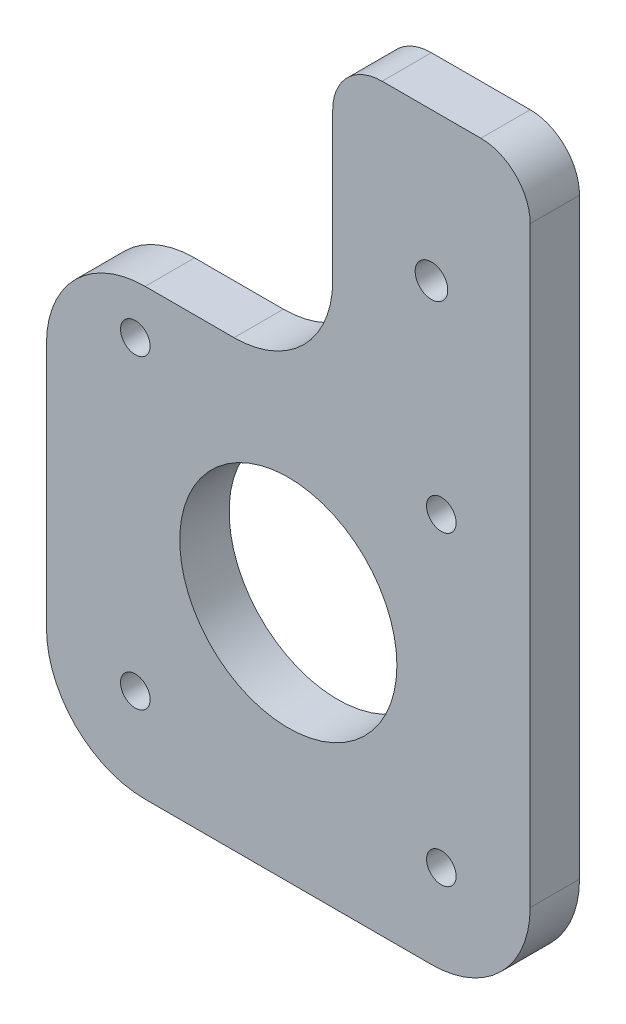
ISO-10303-21;
HEADER;
FILE_DESCRIPTION(('STEP AP214'),'2;1');
FILE_NAME('part.step','',(''),(''),'','','');
FILE_SCHEMA(('AUTOMOTIVE_DESIGN { 1 0 10303 214 1 1 1 1 }'));
ENDSEC;
DATA;
#1=APPLICATION_CONTEXT('core data for automotive mechanical design processes');
#2=APPLICATION_PROTOCOL_DEFINITION('international standard','automotive_design',2000,#1);
#3=PRODUCT_CONTEXT('',#1,'mechanical');
#4=PRODUCT('Part','Part','',(#3));
#5=PRODUCT_RELATED_PRODUCT_CATEGORY('part','',(#4));
#6=PRODUCT_DEFINITION_FORMATION('','',#4);
#7=PRODUCT_DEFINITION_CONTEXT('part definition',#1,'design');
#8=PRODUCT_DEFINITION('design','',#6,#7);
#9=PRODUCT_DEFINITION_SHAPE('','',#8);
#10=(LENGTH_UNIT() NAMED_UNIT(*) SI_UNIT(.MILLI.,.METRE.));
#11=(NAMED_UNIT(*) PLANE_ANGLE_UNIT() SI_UNIT($,.RADIAN.));
#12=(NAMED_UNIT(*) SI_UNIT($,.STERADIAN.) SOLID_ANGLE_UNIT());
#13=UNCERTAINTY_MEASURE_WITH_UNIT(LENGTH_MEASURE(1.E-05),#10,'distance_accuracy_value','');
#14=(GEOMETRIC_REPRESENTATION_CONTEXT(3) GLOBAL_UNCERTAINTY_ASSIGNED_CONTEXT((#13)) GLOBAL_UNIT_ASSIGNED_CONTEXT((#10,
#11,#12)) REPRESENTATION_CONTEXT('',''));
#15=CARTESIAN_POINT('',(0.,0.,0.));
#16=DIRECTION('',(0.,0.,1.));
#17=DIRECTION('',(1.,0.,0.));
#18=AXIS2_PLACEMENT_3D('',#15,#16,#17);
#19=CARTESIAN_POINT('',(0.,0.,5.));
#20=DIRECTION('',(0.,0.,1.));
#21=DIRECTION('',(1.,0.,0.));
#22=AXIS2_PLACEMENT_3D('',#19,#20,#21);
#23=PLANE('',#22);
#24=CARTESIAN_POINT('',(34.8834350731139,-36.,5.));
#25=DIRECTION('',(0.,0.,1.));
#26=DIRECTION('',(1.,0.,0.));
#27=AXIS2_PLACEMENT_3D('',#24,#25,#26);
#28=CIRCLE('',#27,1.5);
#29=CARTESIAN_POINT('',(36.3834350731139,-36.,5.));
#30=VERTEX_POINT('',#29);
#31=EDGE_CURVE('E326',#30,#30,#28,.T.);
#32=ORIENTED_EDGE('',*,*,#31,.F.);
#33=EDGE_LOOP('',(#32));
#34=FACE_BOUND('',#33,.T.);
#35=CARTESIAN_POINT('',(34.8834350731139,-5.,5.));
#36=DIRECTION('',(0.,0.,1.));
#37=DIRECTION('',(1.,0.,0.));
#38=AXIS2_PLACEMENT_3D('',#35,#36,#37);
#39=CIRCLE('',#38,1.5);
#40=CARTESIAN_POINT('',(36.3834350731139,-5.,5.));
#41=VERTEX_POINT('',#40);
#42=EDGE_CURVE('E310',#41,#41,#39,.T.);
#43=ORIENTED_EDGE('',*,*,#42,.F.);
#44=EDGE_LOOP('',(#43));
#45=FACE_BOUND('',#44,.T.);
#46=CARTESIAN_POINT('',(33.8834350731139,15.,5.));
#47=DIRECTION('',(0.,0.,1.));
#48=DIRECTION('',(1.,0.,0.));
#49=AXIS2_PLACEMENT_3D('',#46,#47,#48);
#50=CIRCLE('',#49,1.65);
#51=CARTESIAN_POINT('',(35.5334350731139,15.,5.));
#52=VERTEX_POINT('',#51);
#53=EDGE_CURVE('E163',#52,#52,#50,.T.);
#54=ORIENTED_EDGE('',*,*,#53,.F.);
#55=EDGE_LOOP('',(#54));
#56=FACE_BOUND('',#55,.T.);
#57=DIRECTION('',(-1.,0.,0.));
#58=VECTOR('',#57,1.);
#59=CARTESIAN_POINT('',(23.8834350731139,30.,5.));
#60=LINE('',#59,#58);
#61=CARTESIAN_POINT('',(38.8834350731139,30.,5.));
#62=VERTEX_POINT('',#61);
#63=CARTESIAN_POINT('',(28.8834350731139,30.,5.));
#64=VERTEX_POINT('',#63);
#65=EDGE_CURVE('E252',#62,#64,#60,.T.);
#66=ORIENTED_EDGE('',*,*,#65,.T.);
#67=CARTESIAN_POINT('',(28.8834350731139,25.,5.));
#68=DIRECTION('',(0.,0.,1.));
#69=DIRECTION('',(1.,0.,0.));
#70=AXIS2_PLACEMENT_3D('',#67,#68,#69);
#71=CIRCLE('',#70,5.);
#72=CARTESIAN_POINT('',(23.8834350731139,25.,5.));
#73=VERTEX_POINT('',#72);
#74=EDGE_CURVE('E48',#64,#73,#71,.T.);
#75=ORIENTED_EDGE('',*,*,#74,.T.);
#76=DIRECTION('',(0.,-1.,0.));
#77=VECTOR('',#76,1.);
#78=CARTESIAN_POINT('',(23.8834350731139,30.,5.));
#79=LINE('',#78,#77);
#80=CARTESIAN_POINT('',(23.8834350731139,10.,5.));
#81=VERTEX_POINT('',#80);
#82=EDGE_CURVE('E174',#73,#81,#79,.T.);
#83=ORIENTED_EDGE('',*,*,#82,.T.);
#84=CARTESIAN_POINT('',(13.8834350731139,10.,5.));
#85=DIRECTION('',(0.,0.,1.));
#86=DIRECTION('',(1.,0.,0.));
#87=AXIS2_PLACEMENT_3D('',#84,#85,#86);
#88=CIRCLE('',#87,10.);
#89=CARTESIAN_POINT('',(13.8834350731139,0.,5.));
#90=VERTEX_POINT('',#89);
#91=EDGE_CURVE('E143',#81,#90,#88,.F.);
#92=ORIENTED_EDGE('',*,*,#91,.T.);
#93=DIRECTION('',(-1.,0.,0.));
#94=VECTOR('',#93,1.);
#95=CARTESIAN_POINT('',(23.8834350731139,0.,5.));
#96=LINE('',#95,#94);
#97=CARTESIAN_POINT('',(4.88343507311392,0.,5.));
#98=VERTEX_POINT('',#97);
#99=EDGE_CURVE('E153',#90,#98,#96,.T.);
#100=ORIENTED_EDGE('',*,*,#99,.T.);
#101=CARTESIAN_POINT('',(4.88343507311392,-10.,5.));
#102=DIRECTION('',(0.,0.,1.));
#103=DIRECTION('',(1.,0.,0.));
#104=AXIS2_PLACEMENT_3D('',#101,#102,#103);
#105=CIRCLE('',#104,10.);
#106=CARTESIAN_POINT('',(-5.11656492688608,-9.99999999999999,5.));
#107=VERTEX_POINT('',#106);
#108=EDGE_CURVE('E215',#98,#107,#105,.T.);
#109=ORIENTED_EDGE('',*,*,#108,.T.);
#110=DIRECTION('',(0.,-1.,0.));
#111=VECTOR('',#110,1.);
#112=CARTESIAN_POINT('',(-5.11656492688608,0.,5.));
#113=LINE('',#112,#111);
#114=CARTESIAN_POINT('',(-5.11656492688609,-35.,5.));
#115=VERTEX_POINT('',#114);
#116=EDGE_CURVE('E288',#107,#115,#113,.T.);
#117=ORIENTED_EDGE('',*,*,#116,.T.);
#118=CARTESIAN_POINT('',(4.88343507311391,-35.,5.));
#119=DIRECTION('',(0.,0.,1.));
#120=DIRECTION('',(1.,0.,0.));
#121=AXIS2_PLACEMENT_3D('',#118,#119,#120);
#122=CIRCLE('',#121,10.);
#123=CARTESIAN_POINT('',(4.88343507311392,-45.,5.));
#124=VERTEX_POINT('',#123);
#125=EDGE_CURVE('E221',#115,#124,#122,.T.);
#126=ORIENTED_EDGE('',*,*,#125,.T.);
#127=DIRECTION('',(1.,0.,0.));
#128=VECTOR('',#127,1.);
#129=CARTESIAN_POINT('',(43.8834350731139,-45.,5.));
#130=LINE('',#129,#128);
#131=CARTESIAN_POINT('',(33.8834350731139,-45.,5.));
#132=VERTEX_POINT('',#131);
#133=EDGE_CURVE('E278',#124,#132,#130,.T.);
#134=ORIENTED_EDGE('',*,*,#133,.T.);
#135=CARTESIAN_POINT('',(33.8834350731139,-35.,5.));
#136=DIRECTION('',(0.,0.,1.));
#137=DIRECTION('',(1.,0.,0.));
#138=AXIS2_PLACEMENT_3D('',#135,#136,#137);
#139=CIRCLE('',#138,10.);
#140=CARTESIAN_POINT('',(43.8834350731139,-35.,5.));
#141=VERTEX_POINT('',#140);
#142=EDGE_CURVE('E218',#132,#141,#139,.T.);
#143=ORIENTED_EDGE('',*,*,#142,.T.);
#144=DIRECTION('',(0.,1.,0.));
#145=VECTOR('',#144,1.);
#146=CARTESIAN_POINT('',(43.8834350731139,30.,5.));
#147=LINE('',#146,#145);
#148=CARTESIAN_POINT('',(43.8834350731139,25.,5.));
#149=VERTEX_POINT('',#148);
#150=EDGE_CURVE('E267',#141,#149,#147,.T.);
#151=ORIENTED_EDGE('',*,*,#150,.T.);
#152=CARTESIAN_POINT('',(38.8834350731139,25.,5.));
#153=DIRECTION('',(0.,0.,1.));
#154=DIRECTION('',(1.,0.,0.));
#155=AXIS2_PLACEMENT_3D('',#152,#153,#154);
#156=CIRCLE('',#155,5.);
#157=EDGE_CURVE('E245',#149,#62,#156,.T.);
#158=ORIENTED_EDGE('',*,*,#157,.T.);
#159=EDGE_LOOP('',(#66,#75,#83,#92,#100,#109,#117,#126,#134,#143,#151,#158));
#160=FACE_BOUND('',#159,.T.);
#161=CARTESIAN_POINT('',(3.8834350731139,-5.,5.));
#162=DIRECTION('',(0.,0.,1.));
#163=DIRECTION('',(1.,0.,0.));
#164=AXIS2_PLACEMENT_3D('',#161,#162,#163);
#165=CIRCLE('',#164,1.5);
#166=CARTESIAN_POINT('',(5.38343507311391,-5.,5.));
#167=VERTEX_POINT('',#166);
#168=EDGE_CURVE('E304',#167,#167,#165,.T.);
#169=ORIENTED_EDGE('',*,*,#168,.F.);
#170=EDGE_LOOP('',(#169));
#171=FACE_BOUND('',#170,.T.);
#172=CARTESIAN_POINT('',(3.88343507311391,-36.,5.));
#173=DIRECTION('',(0.,0.,1.));
#174=DIRECTION('',(1.,0.,0.));
#175=AXIS2_PLACEMENT_3D('',#172,#173,#174);
#176=CIRCLE('',#175,1.5);
#177=CARTESIAN_POINT('',(5.38343507311391,-36.,5.));
#178=VERTEX_POINT('',#177);
#179=EDGE_CURVE('E318',#178,#178,#176,.T.);
#180=ORIENTED_EDGE('',*,*,#179,.F.);
#181=EDGE_LOOP('',(#180));
#182=FACE_BOUND('',#181,.T.);
#183=CARTESIAN_POINT('',(19.3834350731139,-20.5,5.));
#184=DIRECTION('',(0.,0.,1.));
#185=DIRECTION('',(1.,0.,0.));
#186=AXIS2_PLACEMENT_3D('',#183,#184,#185);
#187=CIRCLE('',#186,11.);
#188=CARTESIAN_POINT('',(30.3834350731139,-20.5,5.));
#189=VERTEX_POINT('',#188);
#190=EDGE_CURVE('E334',#189,#189,#187,.T.);
#191=ORIENTED_EDGE('',*,*,#190,.F.);
#192=EDGE_LOOP('',(#191));
#193=FACE_BOUND('',#192,.T.);
#194=ADVANCED_FACE('F39',(#34,#45,#56,#160,#171,#182,#193),#23,.T.);
#195=CARTESIAN_POINT('',(0.,0.,0.));
#196=DIRECTION('',(0.,0.,1.));
#197=DIRECTION('',(1.,0.,0.));
#198=AXIS2_PLACEMENT_3D('',#195,#196,#197);
#199=PLANE('',#198);
#200=DIRECTION('',(0.,-1.,0.));
#201=VECTOR('',#200,1.);
#202=CARTESIAN_POINT('',(23.8834350731139,30.,0.));
#203=LINE('',#202,#201);
#204=CARTESIAN_POINT('',(23.8834350731139,25.,0.));
#205=VERTEX_POINT('',#204);
#206=CARTESIAN_POINT('',(23.8834350731139,10.,0.));
#207=VERTEX_POINT('',#206);
#208=EDGE_CURVE('E186',#205,#207,#203,.T.);
#209=ORIENTED_EDGE('',*,*,#208,.F.);
#210=CARTESIAN_POINT('',(28.8834350731139,25.,0.));
#211=DIRECTION('',(0.,0.,1.));
#212=DIRECTION('',(1.,0.,0.));
#213=AXIS2_PLACEMENT_3D('',#210,#211,#212);
#214=CIRCLE('',#213,5.);
#215=CARTESIAN_POINT('',(28.8834350731139,30.,0.));
#216=VERTEX_POINT('',#215);
#217=EDGE_CURVE('E236',#205,#216,#214,.F.);
#218=ORIENTED_EDGE('',*,*,#217,.T.);
#219=DIRECTION('',(-1.,0.,0.));
#220=VECTOR('',#219,1.);
#221=CARTESIAN_POINT('',(23.8834350731139,30.,0.));
#222=LINE('',#221,#220);
#223=CARTESIAN_POINT('',(38.8834350731139,30.,0.));
#224=VERTEX_POINT('',#223);
#225=EDGE_CURVE('E183',#224,#216,#222,.T.);
#226=ORIENTED_EDGE('',*,*,#225,.F.);
#227=CARTESIAN_POINT('',(38.8834350731139,25.,0.));
#228=DIRECTION('',(0.,0.,1.));
#229=DIRECTION('',(1.,0.,0.));
#230=AXIS2_PLACEMENT_3D('',#227,#228,#229);
#231=CIRCLE('',#230,5.);
#232=CARTESIAN_POINT('',(43.8834350731139,25.,0.));
#233=VERTEX_POINT('',#232);
#234=EDGE_CURVE('E233',#224,#233,#231,.F.);
#235=ORIENTED_EDGE('',*,*,#234,.T.);
#236=DIRECTION('',(0.,1.,0.));
#237=VECTOR('',#236,1.);
#238=CARTESIAN_POINT('',(43.8834350731139,30.,0.));
#239=LINE('',#238,#237);
#240=CARTESIAN_POINT('',(43.8834350731139,-35.,0.));
#241=VERTEX_POINT('',#240);
#242=EDGE_CURVE('E180',#241,#233,#239,.T.);
#243=ORIENTED_EDGE('',*,*,#242,.F.);
#244=CARTESIAN_POINT('',(33.8834350731139,-35.,0.));
#245=DIRECTION('',(0.,0.,1.));
#246=DIRECTION('',(1.,0.,0.));
#247=AXIS2_PLACEMENT_3D('',#244,#245,#246);
#248=CIRCLE('',#247,10.);
#249=CARTESIAN_POINT('',(33.8834350731139,-45.,0.));
#250=VERTEX_POINT('',#249);
#251=EDGE_CURVE('E202',#241,#250,#248,.F.);
#252=ORIENTED_EDGE('',*,*,#251,.T.);
#253=DIRECTION('',(1.,0.,0.));
#254=VECTOR('',#253,1.);
#255=CARTESIAN_POINT('',(43.8834350731139,-45.,0.));
#256=LINE('',#255,#254);
#257=CARTESIAN_POINT('',(4.88343507311392,-45.,0.));
#258=VERTEX_POINT('',#257);
#259=EDGE_CURVE('E168',#258,#250,#256,.T.);
#260=ORIENTED_EDGE('',*,*,#259,.F.);
#261=CARTESIAN_POINT('',(4.88343507311391,-35.,0.));
#262=DIRECTION('',(0.,0.,1.));
#263=DIRECTION('',(1.,0.,0.));
#264=AXIS2_PLACEMENT_3D('',#261,#262,#263);
#265=CIRCLE('',#264,10.);
#266=CARTESIAN_POINT('',(-5.11656492688609,-35.,0.));
#267=VERTEX_POINT('',#266);
#268=EDGE_CURVE('E205',#258,#267,#265,.F.);
#269=ORIENTED_EDGE('',*,*,#268,.T.);
#270=DIRECTION('',(0.,-1.,0.));
#271=VECTOR('',#270,1.);
#272=CARTESIAN_POINT('',(-5.11656492688608,0.,0.));
#273=LINE('',#272,#271);
#274=CARTESIAN_POINT('',(-5.11656492688608,-9.99999999999999,0.));
#275=VERTEX_POINT('',#274);
#276=EDGE_CURVE('E162',#275,#267,#273,.T.);
#277=ORIENTED_EDGE('',*,*,#276,.F.);
#278=CARTESIAN_POINT('',(4.88343507311392,-10.,0.));
#279=DIRECTION('',(0.,0.,1.));
#280=DIRECTION('',(1.,0.,0.));
#281=AXIS2_PLACEMENT_3D('',#278,#279,#280);
#282=CIRCLE('',#281,10.);
#283=CARTESIAN_POINT('',(4.88343507311392,0.,0.));
#284=VERTEX_POINT('',#283);
#285=EDGE_CURVE('E160',#275,#284,#282,.F.);
#286=ORIENTED_EDGE('',*,*,#285,.T.);
#287=DIRECTION('',(-1.,0.,0.));
#288=VECTOR('',#287,1.);
#289=CARTESIAN_POINT('',(0.,0.,0.));
#290=LINE('',#289,#288);
#291=CARTESIAN_POINT('',(13.8834350731139,0.,0.));
#292=VERTEX_POINT('',#291);
#293=EDGE_CURVE('E150',#292,#284,#290,.T.);
#294=ORIENTED_EDGE('',*,*,#293,.F.);
#295=CARTESIAN_POINT('',(13.8834350731139,10.,0.));
#296=DIRECTION('',(0.,0.,1.));
#297=DIRECTION('',(1.,0.,0.));
#298=AXIS2_PLACEMENT_3D('',#295,#296,#297);
#299=CIRCLE('',#298,10.);
#300=EDGE_CURVE('E132',#292,#207,#299,.T.);
#301=ORIENTED_EDGE('',*,*,#300,.T.);
#302=EDGE_LOOP('',(#209,#218,#226,#235,#243,#252,#260,#269,#277,#286,#294,#301));
#303=FACE_BOUND('',#302,.T.);
#304=CARTESIAN_POINT('',(33.8834350731139,15.,0.));
#305=DIRECTION('',(0.,0.,1.));
#306=DIRECTION('',(1.,0.,0.));
#307=AXIS2_PLACEMENT_3D('',#304,#305,#306);
#308=CIRCLE('',#307,1.65);
#309=CARTESIAN_POINT('',(35.5334350731139,15.,0.));
#310=VERTEX_POINT('',#309);
#311=EDGE_CURVE('E171',#310,#310,#308,.T.);
#312=ORIENTED_EDGE('',*,*,#311,.T.);
#313=EDGE_LOOP('',(#312));
#314=FACE_BOUND('',#313,.T.);
#315=CARTESIAN_POINT('',(3.8834350731139,-5.,0.));
#316=DIRECTION('',(0.,0.,1.));
#317=DIRECTION('',(1.,0.,0.));
#318=AXIS2_PLACEMENT_3D('',#315,#316,#317);
#319=CIRCLE('',#318,1.5);
#320=CARTESIAN_POINT('',(5.38343507311391,-5.,0.));
#321=VERTEX_POINT('',#320);
#322=EDGE_CURVE('E306',#321,#321,#319,.T.);
#323=ORIENTED_EDGE('',*,*,#322,.T.);
#324=EDGE_LOOP('',(#323));
#325=FACE_BOUND('',#324,.T.);
#326=CARTESIAN_POINT('',(34.8834350731139,-5.,0.));
#327=DIRECTION('',(0.,0.,1.));
#328=DIRECTION('',(1.,0.,0.));
#329=AXIS2_PLACEMENT_3D('',#326,#327,#328);
#330=CIRCLE('',#329,1.5);
#331=CARTESIAN_POINT('',(36.3834350731139,-5.,0.));
#332=VERTEX_POINT('',#331);
#333=EDGE_CURVE('E314',#332,#332,#330,.T.);
#334=ORIENTED_EDGE('',*,*,#333,.T.);
#335=EDGE_LOOP('',(#334));
#336=FACE_BOUND('',#335,.T.);
#337=CARTESIAN_POINT('',(3.88343507311391,-36.,0.));
#338=DIRECTION('',(0.,0.,1.));
#339=DIRECTION('',(1.,0.,0.));
#340=AXIS2_PLACEMENT_3D('',#337,#338,#339);
#341=CIRCLE('',#340,1.5);
#342=CARTESIAN_POINT('',(5.38343507311391,-36.,0.));
#343=VERTEX_POINT('',#342);
#344=EDGE_CURVE('E322',#343,#343,#341,.T.);
#345=ORIENTED_EDGE('',*,*,#344,.T.);
#346=EDGE_LOOP('',(#345));
#347=FACE_BOUND('',#346,.T.);
#348=CARTESIAN_POINT('',(34.8834350731139,-36.,0.));
#349=DIRECTION('',(0.,0.,1.));
#350=DIRECTION('',(1.,0.,0.));
#351=AXIS2_PLACEMENT_3D('',#348,#349,#350);
#352=CIRCLE('',#351,1.5);
#353=CARTESIAN_POINT('',(36.3834350731139,-36.,0.));
#354=VERTEX_POINT('',#353);
#355=EDGE_CURVE('E330',#354,#354,#352,.T.);
#356=ORIENTED_EDGE('',*,*,#355,.T.);
#357=EDGE_LOOP('',(#356));
#358=FACE_BOUND('',#357,.T.);
#359=CARTESIAN_POINT('',(19.3834350731139,-20.5,0.));
#360=DIRECTION('',(0.,0.,1.));
#361=DIRECTION('',(1.,0.,0.));
#362=AXIS2_PLACEMENT_3D('',#359,#360,#361);
#363=CIRCLE('',#362,11.);
#364=CARTESIAN_POINT('',(30.3834350731139,-20.5,0.));
#365=VERTEX_POINT('',#364);
#366=EDGE_CURVE('E338',#365,#365,#363,.T.);
#367=ORIENTED_EDGE('',*,*,#366,.T.);
#368=EDGE_LOOP('',(#367));
#369=FACE_BOUND('',#368,.T.);
#370=ADVANCED_FACE('F157',(#303,#314,#325,#336,#347,#358,#369),#199,.F.);
#371=CARTESIAN_POINT('',(0.,0.,5.));
#372=DIRECTION('',(0.,-1.,0.));
#373=DIRECTION('',(0.,0.,-1.));
#374=AXIS2_PLACEMENT_3D('',#371,#372,#373);
#375=PLANE('',#374);
#376=ORIENTED_EDGE('',*,*,#99,.F.);
#377=DIRECTION('',(0.,0.,-1.));
#378=VECTOR('',#377,1.);
#379=CARTESIAN_POINT('',(13.8834350731139,0.,0.));
#380=LINE('',#379,#378);
#381=EDGE_CURVE('E136',#90,#292,#380,.T.);
#382=ORIENTED_EDGE('',*,*,#381,.T.);
#383=ORIENTED_EDGE('',*,*,#293,.T.);
#384=DIRECTION('',(0.,0.,-1.));
#385=VECTOR('',#384,1.);
#386=CARTESIAN_POINT('',(4.88343507311392,0.,5.));
#387=LINE('',#386,#385);
#388=EDGE_CURVE('E155',#284,#98,#387,.F.);
#389=ORIENTED_EDGE('',*,*,#388,.T.);
#390=EDGE_LOOP('',(#376,#382,#383,#389));
#391=FACE_BOUND('',#390,.T.);
#392=ADVANCED_FACE('F149',(#391),#375,.F.);
#393=CARTESIAN_POINT('',(-5.11656492688608,0.,5.));
#394=DIRECTION('',(1.,0.,0.));
#395=DIRECTION('',(0.,1.,0.));
#396=AXIS2_PLACEMENT_3D('',#393,#394,#395);
#397=PLANE('',#396);
#398=ORIENTED_EDGE('',*,*,#276,.T.);
#399=DIRECTION('',(0.,0.,-1.));
#400=VECTOR('',#399,1.);
#401=CARTESIAN_POINT('',(-5.11656492688609,-35.,5.));
#402=LINE('',#401,#400);
#403=EDGE_CURVE('E212',#267,#115,#402,.F.);
#404=ORIENTED_EDGE('',*,*,#403,.T.);
#405=ORIENTED_EDGE('',*,*,#116,.F.);
#406=DIRECTION('',(0.,0.,-1.));
#407=VECTOR('',#406,1.);
#408=CARTESIAN_POINT('',(-5.11656492688608,-10.,5.));
#409=LINE('',#408,#407);
#410=EDGE_CURVE('E208',#107,#275,#409,.T.);
#411=ORIENTED_EDGE('',*,*,#410,.T.);
#412=EDGE_LOOP('',(#398,#404,#405,#411));
#413=FACE_BOUND('',#412,.T.);
#414=ADVANCED_FACE('F284',(#413),#397,.F.);
#415=CARTESIAN_POINT('',(43.8834350731139,-45.,5.));
#416=DIRECTION('',(0.,1.,0.));
#417=DIRECTION('',(-1.,0.,0.));
#418=AXIS2_PLACEMENT_3D('',#415,#416,#417);
#419=PLANE('',#418);
#420=ORIENTED_EDGE('',*,*,#133,.F.);
#421=DIRECTION('',(0.,0.,-1.));
#422=VECTOR('',#421,1.);
#423=CARTESIAN_POINT('',(4.88343507311391,-45.,5.));
#424=LINE('',#423,#422);
#425=EDGE_CURVE('E196',#124,#258,#424,.T.);
#426=ORIENTED_EDGE('',*,*,#425,.T.);
#427=ORIENTED_EDGE('',*,*,#259,.T.);
#428=DIRECTION('',(0.,0.,-1.));
#429=VECTOR('',#428,1.);
#430=CARTESIAN_POINT('',(33.8834350731139,-45.,5.));
#431=LINE('',#430,#429);
#432=EDGE_CURVE('E193',#250,#132,#431,.F.);
#433=ORIENTED_EDGE('',*,*,#432,.T.);
#434=EDGE_LOOP('',(#420,#426,#427,#433));
#435=FACE_BOUND('',#434,.T.);
#436=ADVANCED_FACE('F275',(#435),#419,.F.);
#437=CARTESIAN_POINT('',(43.8834350731139,30.,5.));
#438=DIRECTION('',(-1.,0.,0.));
#439=DIRECTION('',(0.,-1.,0.));
#440=AXIS2_PLACEMENT_3D('',#437,#438,#439);
#441=PLANE('',#440);
#442=ORIENTED_EDGE('',*,*,#242,.T.);
#443=DIRECTION('',(0.,0.,-1.));
#444=VECTOR('',#443,1.);
#445=CARTESIAN_POINT('',(43.8834350731139,25.,5.));
#446=LINE('',#445,#444);
#447=EDGE_CURVE('E11',#233,#149,#446,.F.);
#448=ORIENTED_EDGE('',*,*,#447,.T.);
#449=ORIENTED_EDGE('',*,*,#150,.F.);
#450=DIRECTION('',(0.,0.,-1.));
#451=VECTOR('',#450,1.);
#452=CARTESIAN_POINT('',(43.8834350731139,-35.,5.));
#453=LINE('',#452,#451);
#454=EDGE_CURVE('E144',#141,#241,#453,.T.);
#455=ORIENTED_EDGE('',*,*,#454,.T.);
#456=EDGE_LOOP('',(#442,#448,#449,#455));
#457=FACE_BOUND('',#456,.T.);
#458=ADVANCED_FACE('F265',(#457),#441,.F.);
#459=CARTESIAN_POINT('',(23.8834350731139,30.,5.));
#460=DIRECTION('',(0.,-1.,0.));
#461=DIRECTION('',(0.,0.,-1.));
#462=AXIS2_PLACEMENT_3D('',#459,#460,#461);
#463=PLANE('',#462);
#464=ORIENTED_EDGE('',*,*,#225,.T.);
#465=DIRECTION('',(0.,0.,-1.));
#466=VECTOR('',#465,1.);
#467=CARTESIAN_POINT('',(28.8834350731139,30.,5.));
#468=LINE('',#467,#466);
#469=EDGE_CURVE('E61',#216,#64,#468,.F.);
#470=ORIENTED_EDGE('',*,*,#469,.T.);
#471=ORIENTED_EDGE('',*,*,#65,.F.);
#472=DIRECTION('',(0.,0.,-1.));
#473=VECTOR('',#472,1.);
#474=CARTESIAN_POINT('',(38.8834350731139,30.,5.));
#475=LINE('',#474,#473);
#476=EDGE_CURVE('E239',#62,#224,#475,.T.);
#477=ORIENTED_EDGE('',*,*,#476,.T.);
#478=EDGE_LOOP('',(#464,#470,#471,#477));
#479=FACE_BOUND('',#478,.T.);
#480=ADVANCED_FACE('F260',(#479),#463,.F.);
#481=CARTESIAN_POINT('',(23.8834350731139,30.,5.));
#482=DIRECTION('',(1.,0.,0.));
#483=DIRECTION('',(0.,1.,0.));
#484=AXIS2_PLACEMENT_3D('',#481,#482,#483);
#485=PLANE('',#484);
#486=ORIENTED_EDGE('',*,*,#82,.F.);
#487=DIRECTION('',(0.,0.,-1.));
#488=VECTOR('',#487,1.);
#489=CARTESIAN_POINT('',(23.8834350731139,25.,5.));
#490=LINE('',#489,#488);
#491=EDGE_CURVE('E229',#73,#205,#490,.T.);
#492=ORIENTED_EDGE('',*,*,#491,.T.);
#493=ORIENTED_EDGE('',*,*,#208,.T.);
#494=DIRECTION('',(0.,0.,-1.));
#495=VECTOR('',#494,1.);
#496=CARTESIAN_POINT('',(23.8834350731139,10.,5.));
#497=LINE('',#496,#495);
#498=EDGE_CURVE('E138',#207,#81,#497,.F.);
#499=ORIENTED_EDGE('',*,*,#498,.T.);
#500=EDGE_LOOP('',(#486,#492,#493,#499));
#501=FACE_BOUND('',#500,.T.);
#502=ADVANCED_FACE('F256',(#501),#485,.F.);
#503=CARTESIAN_POINT('',(33.8834350731139,15.,5.));
#504=DIRECTION('',(0.,0.,-1.));
#505=DIRECTION('',(-1.,0.,0.));
#506=AXIS2_PLACEMENT_3D('',#503,#504,#505);
#507=CYLINDRICAL_SURFACE('',#506,1.65);
#508=ORIENTED_EDGE('',*,*,#53,.T.);
#509=EDGE_LOOP('',(#508));
#510=FACE_BOUND('',#509,.T.);
#511=ORIENTED_EDGE('',*,*,#311,.F.);
#512=EDGE_LOOP('',(#511));
#513=FACE_BOUND('',#512,.T.);
#514=ADVANCED_FACE('F359',(#510,#513),#507,.F.);
#515=CARTESIAN_POINT('',(3.8834350731139,-5.,5.));
#516=DIRECTION('',(0.,0.,-1.));
#517=DIRECTION('',(-1.,0.,0.));
#518=AXIS2_PLACEMENT_3D('',#515,#516,#517);
#519=CYLINDRICAL_SURFACE('',#518,1.5);
#520=ORIENTED_EDGE('',*,*,#168,.T.);
#521=EDGE_LOOP('',(#520));
#522=FACE_BOUND('',#521,.T.);
#523=ORIENTED_EDGE('',*,*,#322,.F.);
#524=EDGE_LOOP('',(#523));
#525=FACE_BOUND('',#524,.T.);
#526=ADVANCED_FACE('F502',(#522,#525),#519,.F.);
#527=CARTESIAN_POINT('',(34.8834350731139,-5.,5.));
#528=DIRECTION('',(0.,0.,-1.));
#529=DIRECTION('',(-1.,0.,0.));
#530=AXIS2_PLACEMENT_3D('',#527,#528,#529);
#531=CYLINDRICAL_SURFACE('',#530,1.5);
#532=ORIENTED_EDGE('',*,*,#42,.T.);
#533=EDGE_LOOP('',(#532));
#534=FACE_BOUND('',#533,.T.);
#535=ORIENTED_EDGE('',*,*,#333,.F.);
#536=EDGE_LOOP('',(#535));
#537=FACE_BOUND('',#536,.T.);
#538=ADVANCED_FACE('F492',(#534,#537),#531,.F.);
#539=CARTESIAN_POINT('',(3.88343507311391,-36.,5.));
#540=DIRECTION('',(0.,0.,-1.));
#541=DIRECTION('',(-1.,0.,0.));
#542=AXIS2_PLACEMENT_3D('',#539,#540,#541);
#543=CYLINDRICAL_SURFACE('',#542,1.5);
#544=ORIENTED_EDGE('',*,*,#179,.T.);
#545=EDGE_LOOP('',(#544));
#546=FACE_BOUND('',#545,.T.);
#547=ORIENTED_EDGE('',*,*,#344,.F.);
#548=EDGE_LOOP('',(#547));
#549=FACE_BOUND('',#548,.T.);
#550=ADVANCED_FACE('F482',(#546,#549),#543,.F.);
#551=CARTESIAN_POINT('',(34.8834350731139,-36.,5.));
#552=DIRECTION('',(0.,0.,-1.));
#553=DIRECTION('',(-1.,0.,0.));
#554=AXIS2_PLACEMENT_3D('',#551,#552,#553);
#555=CYLINDRICAL_SURFACE('',#554,1.5);
#556=ORIENTED_EDGE('',*,*,#31,.T.);
#557=EDGE_LOOP('',(#556));
#558=FACE_BOUND('',#557,.T.);
#559=ORIENTED_EDGE('',*,*,#355,.F.);
#560=EDGE_LOOP('',(#559));
#561=FACE_BOUND('',#560,.T.);
#562=ADVANCED_FACE('F473',(#558,#561),#555,.F.);
#563=CARTESIAN_POINT('',(19.3834350731139,-20.5,5.));
#564=DIRECTION('',(0.,0.,-1.));
#565=DIRECTION('',(-1.,0.,0.));
#566=AXIS2_PLACEMENT_3D('',#563,#564,#565);
#567=CYLINDRICAL_SURFACE('',#566,11.);
#568=ORIENTED_EDGE('',*,*,#190,.T.);
#569=EDGE_LOOP('',(#568));
#570=FACE_BOUND('',#569,.T.);
#571=ORIENTED_EDGE('',*,*,#366,.F.);
#572=EDGE_LOOP('',(#571));
#573=FACE_BOUND('',#572,.T.);
#574=ADVANCED_FACE('F346',(#570,#573),#567,.F.);
#575=CARTESIAN_POINT('',(13.8834350731139,10.,5.));
#576=DIRECTION('',(0.,0.,1.));
#577=DIRECTION('',(1.,0.,0.));
#578=AXIS2_PLACEMENT_3D('',#575,#576,#577);
#579=CYLINDRICAL_SURFACE('',#578,10.);
#580=ORIENTED_EDGE('',*,*,#91,.F.);
#581=ORIENTED_EDGE('',*,*,#498,.F.);
#582=ORIENTED_EDGE('',*,*,#300,.F.);
#583=ORIENTED_EDGE('',*,*,#381,.F.);
#584=EDGE_LOOP('',(#580,#581,#582,#583));
#585=FACE_BOUND('',#584,.T.);
#586=ADVANCED_FACE('F135',(#585),#579,.F.);
#587=CARTESIAN_POINT('',(4.88343507311391,-35.,5.));
#588=DIRECTION('',(0.,0.,-1.));
#589=DIRECTION('',(-1.,0.,0.));
#590=AXIS2_PLACEMENT_3D('',#587,#588,#589);
#591=CYLINDRICAL_SURFACE('',#590,10.);
#592=ORIENTED_EDGE('',*,*,#125,.F.);
#593=ORIENTED_EDGE('',*,*,#403,.F.);
#594=ORIENTED_EDGE('',*,*,#268,.F.);
#595=ORIENTED_EDGE('',*,*,#425,.F.);
#596=EDGE_LOOP('',(#592,#593,#594,#595));
#597=FACE_BOUND('',#596,.T.);
#598=ADVANCED_FACE('F281',(#597),#591,.T.);
#599=CARTESIAN_POINT('',(33.8834350731139,-35.,5.));
#600=DIRECTION('',(0.,0.,-1.));
#601=DIRECTION('',(-1.,0.,0.));
#602=AXIS2_PLACEMENT_3D('',#599,#600,#601);
#603=CYLINDRICAL_SURFACE('',#602,10.);
#604=ORIENTED_EDGE('',*,*,#142,.F.);
#605=ORIENTED_EDGE('',*,*,#432,.F.);
#606=ORIENTED_EDGE('',*,*,#251,.F.);
#607=ORIENTED_EDGE('',*,*,#454,.F.);
#608=EDGE_LOOP('',(#604,#605,#606,#607));
#609=FACE_BOUND('',#608,.T.);
#610=ADVANCED_FACE('F270',(#609),#603,.T.);
#611=CARTESIAN_POINT('',(4.88343507311392,-10.,5.));
#612=DIRECTION('',(0.,0.,-1.));
#613=DIRECTION('',(-1.,0.,0.));
#614=AXIS2_PLACEMENT_3D('',#611,#612,#613);
#615=CYLINDRICAL_SURFACE('',#614,10.);
#616=ORIENTED_EDGE('',*,*,#108,.F.);
#617=ORIENTED_EDGE('',*,*,#388,.F.);
#618=ORIENTED_EDGE('',*,*,#285,.F.);
#619=ORIENTED_EDGE('',*,*,#410,.F.);
#620=EDGE_LOOP('',(#616,#617,#618,#619));
#621=FACE_BOUND('',#620,.T.);
#622=ADVANCED_FACE('F291',(#621),#615,.T.);
#623=CARTESIAN_POINT('',(28.8834350731139,25.,5.));
#624=DIRECTION('',(0.,0.,-1.));
#625=DIRECTION('',(-1.,0.,0.));
#626=AXIS2_PLACEMENT_3D('',#623,#624,#625);
#627=CYLINDRICAL_SURFACE('',#626,5.);
#628=ORIENTED_EDGE('',*,*,#74,.F.);
#629=ORIENTED_EDGE('',*,*,#469,.F.);
#630=ORIENTED_EDGE('',*,*,#217,.F.);
#631=ORIENTED_EDGE('',*,*,#491,.F.);
#632=EDGE_LOOP('',(#628,#629,#630,#631));
#633=FACE_BOUND('',#632,.T.);
#634=ADVANCED_FACE('F258',(#633),#627,.T.);
#635=CARTESIAN_POINT('',(38.8834350731139,25.,5.));
#636=DIRECTION('',(0.,0.,-1.));
#637=DIRECTION('',(-1.,0.,0.));
#638=AXIS2_PLACEMENT_3D('',#635,#636,#637);
#639=CYLINDRICAL_SURFACE('',#638,5.);
#640=ORIENTED_EDGE('',*,*,#157,.F.);
#641=ORIENTED_EDGE('',*,*,#447,.F.);
#642=ORIENTED_EDGE('',*,*,#234,.F.);
#643=ORIENTED_EDGE('',*,*,#476,.F.);
#644=EDGE_LOOP('',(#640,#641,#642,#643));
#645=FACE_BOUND('',#644,.T.);
#646=ADVANCED_FACE('F41',(#645),#639,.T.);
#647=CLOSED_SHELL('',(#194,#370,#392,#414,#436,#458,#480,#502,#514,#526,#538,#550,#562,#574,
#586,#598,#610,#622,#634,#646));
#648=MANIFOLD_SOLID_BREP('B2',#647);
#649=ADVANCED_BREP_SHAPE_REPRESENTATION('',(#18,#648),#14);
#650=SHAPE_DEFINITION_REPRESENTATION(#9,#649);
ENDSEC;
END-ISO-10303-21;
